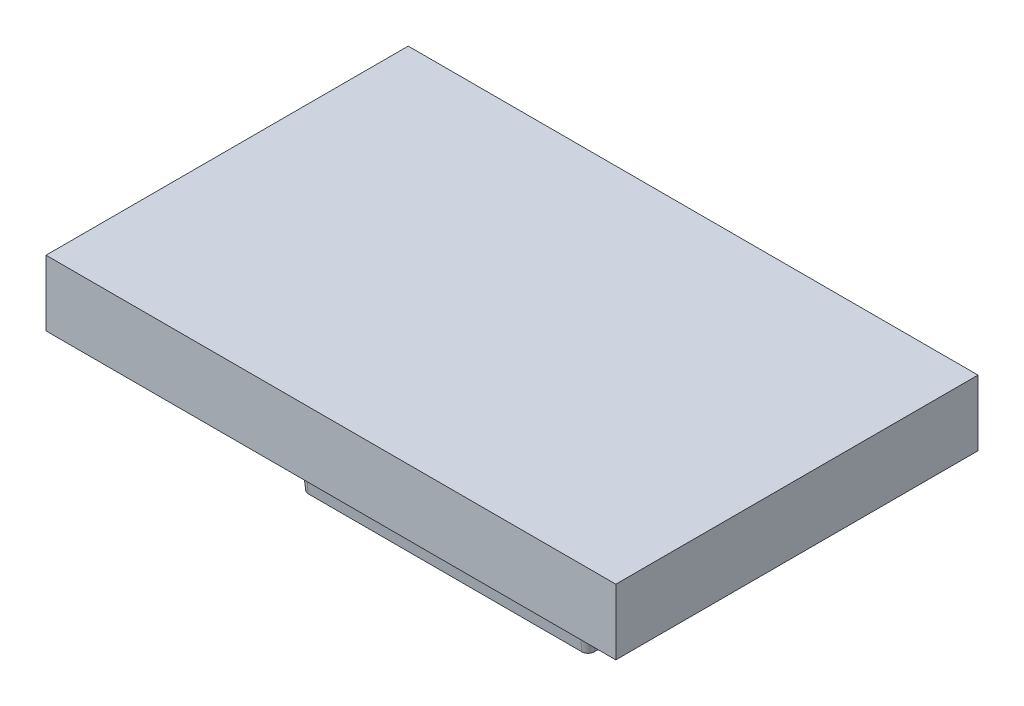
ISO-10303-21;
HEADER;
FILE_DESCRIPTION(('STEP AP214'),'2;1');
FILE_NAME('part.step','',(''),(''),'','','');
FILE_SCHEMA(('AUTOMOTIVE_DESIGN { 1 0 10303 214 1 1 1 1 }'));
ENDSEC;
DATA;
#1=APPLICATION_CONTEXT('core data for automotive mechanical design processes');
#2=APPLICATION_PROTOCOL_DEFINITION('international standard','automotive_design',2000,#1);
#3=PRODUCT_CONTEXT('',#1,'mechanical');
#4=PRODUCT('Part','Part','',(#3));
#5=PRODUCT_RELATED_PRODUCT_CATEGORY('part','',(#4));
#6=PRODUCT_DEFINITION_FORMATION('','',#4);
#7=PRODUCT_DEFINITION_CONTEXT('part definition',#1,'design');
#8=PRODUCT_DEFINITION('design','',#6,#7);
#9=PRODUCT_DEFINITION_SHAPE('','',#8);
#10=(LENGTH_UNIT() NAMED_UNIT(*) SI_UNIT(.MILLI.,.METRE.));
#11=(NAMED_UNIT(*) PLANE_ANGLE_UNIT() SI_UNIT($,.RADIAN.));
#12=(NAMED_UNIT(*) SI_UNIT($,.STERADIAN.) SOLID_ANGLE_UNIT());
#13=UNCERTAINTY_MEASURE_WITH_UNIT(LENGTH_MEASURE(1.E-05),#10,'distance_accuracy_value','');
#14=(GEOMETRIC_REPRESENTATION_CONTEXT(3) GLOBAL_UNCERTAINTY_ASSIGNED_CONTEXT((#13)) GLOBAL_UNIT_ASSIGNED_CONTEXT((#10,
#11,#12)) REPRESENTATION_CONTEXT('',''));
#15=CARTESIAN_POINT('',(0.,0.,0.));
#16=DIRECTION('',(0.,0.,1.));
#17=DIRECTION('',(1.,0.,0.));
#18=AXIS2_PLACEMENT_3D('',#15,#16,#17);
#19=CARTESIAN_POINT('',(0.,100.18,0.));
#20=DIRECTION('',(0.,1.,0.));
#21=DIRECTION('',(0.,0.,1.));
#22=AXIS2_PLACEMENT_3D('',#19,#20,#21);
#23=PLANE('',#22);
#24=DIRECTION('',(0.,0.,1.));
#25=VECTOR('',#24,1.);
#26=CARTESIAN_POINT('',(142.792126276609,100.18,-90.7593904150351));
#27=LINE('',#26,#25);
#28=CARTESIAN_POINT('',(142.792126276609,100.18,-90.7593904150351));
#29=VERTEX_POINT('',#28);
#30=CARTESIAN_POINT('',(142.792126276609,100.18,90.7593904150351));
#31=VERTEX_POINT('',#30);
#32=EDGE_CURVE('E248',#29,#31,#27,.T.);
#33=ORIENTED_EDGE('',*,*,#32,.F.);
#34=DIRECTION('',(1.,0.,0.));
#35=VECTOR('',#34,1.);
#36=CARTESIAN_POINT('',(-142.792126276609,100.18,-90.7593904150351));
#37=LINE('',#36,#35);
#38=CARTESIAN_POINT('',(-142.792126276609,100.18,-90.7593904150351));
#39=VERTEX_POINT('',#38);
#40=EDGE_CURVE('E257',#39,#29,#37,.T.);
#41=ORIENTED_EDGE('',*,*,#40,.F.);
#42=DIRECTION('',(0.,0.,-1.));
#43=VECTOR('',#42,1.);
#44=CARTESIAN_POINT('',(-142.792126276609,100.18,-90.7593904150351));
#45=LINE('',#44,#43);
#46=CARTESIAN_POINT('',(-142.792126276609,100.18,90.7593904150351));
#47=VERTEX_POINT('',#46);
#48=EDGE_CURVE('E254',#47,#39,#45,.T.);
#49=ORIENTED_EDGE('',*,*,#48,.F.);
#50=DIRECTION('',(-1.,0.,0.));
#51=VECTOR('',#50,1.);
#52=CARTESIAN_POINT('',(-142.792126276609,100.18,90.7593904150351));
#53=LINE('',#52,#51);
#54=EDGE_CURVE('E251',#31,#47,#53,.T.);
#55=ORIENTED_EDGE('',*,*,#54,.F.);
#56=EDGE_LOOP('',(#33,#41,#49,#55));
#57=FACE_BOUND('',#56,.T.);
#58=ADVANCED_FACE('F34',(#57),#23,.T.);
#59=CARTESIAN_POINT('',(-142.792126276609,100.18,90.7593904150351));
#60=DIRECTION('',(0.,0.,1.));
#61=DIRECTION('',(1.,0.,0.));
#62=AXIS2_PLACEMENT_3D('',#59,#60,#61);
#63=PLANE('',#62);
#64=DIRECTION('',(0.,-1.,0.));
#65=VECTOR('',#64,1.);
#66=CARTESIAN_POINT('',(-142.792126276609,100.18,90.7593904150351));
#67=LINE('',#66,#65);
#68=CARTESIAN_POINT('',(-142.792126276609,67.31,90.7593904150351));
#69=VERTEX_POINT('',#68);
#70=EDGE_CURVE('E267',#47,#69,#67,.T.);
#71=ORIENTED_EDGE('',*,*,#70,.T.);
#72=DIRECTION('',(1.,0.,0.));
#73=VECTOR('',#72,1.);
#74=CARTESIAN_POINT('',(-142.792126276609,67.31,90.7593904150351));
#75=LINE('',#74,#73);
#76=CARTESIAN_POINT('',(142.792126276609,67.31,90.7593904150351));
#77=VERTEX_POINT('',#76);
#78=EDGE_CURVE('E38',#69,#77,#75,.T.);
#79=ORIENTED_EDGE('',*,*,#78,.T.);
#80=DIRECTION('',(0.,-1.,0.));
#81=VECTOR('',#80,1.);
#82=CARTESIAN_POINT('',(142.792126276609,100.18,90.7593904150351));
#83=LINE('',#82,#81);
#84=EDGE_CURVE('E260',#31,#77,#83,.T.);
#85=ORIENTED_EDGE('',*,*,#84,.F.);
#86=ORIENTED_EDGE('',*,*,#54,.T.);
#87=EDGE_LOOP('',(#71,#79,#85,#86));
#88=FACE_BOUND('',#87,.T.);
#89=ADVANCED_FACE('F284',(#88),#63,.T.);
#90=CARTESIAN_POINT('',(-142.792126276609,100.18,-90.7593904150351));
#91=DIRECTION('',(-1.,0.,0.));
#92=DIRECTION('',(0.,0.,1.));
#93=AXIS2_PLACEMENT_3D('',#90,#91,#92);
#94=PLANE('',#93);
#95=DIRECTION('',(0.,-1.,0.));
#96=VECTOR('',#95,1.);
#97=CARTESIAN_POINT('',(-142.792126276609,100.18,-90.7593904150351));
#98=LINE('',#97,#96);
#99=CARTESIAN_POINT('',(-142.792126276609,67.31,-90.7593904150351));
#100=VERTEX_POINT('',#99);
#101=EDGE_CURVE('E264',#39,#100,#98,.T.);
#102=ORIENTED_EDGE('',*,*,#101,.T.);
#103=DIRECTION('',(0.,0.,1.));
#104=VECTOR('',#103,1.);
#105=CARTESIAN_POINT('',(-142.792126276609,67.31,-90.7593904150351));
#106=LINE('',#105,#104);
#107=EDGE_CURVE('E221',#100,#69,#106,.T.);
#108=ORIENTED_EDGE('',*,*,#107,.T.);
#109=ORIENTED_EDGE('',*,*,#70,.F.);
#110=ORIENTED_EDGE('',*,*,#48,.T.);
#111=EDGE_LOOP('',(#102,#108,#109,#110));
#112=FACE_BOUND('',#111,.T.);
#113=ADVANCED_FACE('F294',(#112),#94,.T.);
#114=CARTESIAN_POINT('',(-142.792126276609,100.18,-90.7593904150351));
#115=DIRECTION('',(0.,0.,-1.));
#116=DIRECTION('',(-1.,0.,0.));
#117=AXIS2_PLACEMENT_3D('',#114,#115,#116);
#118=PLANE('',#117);
#119=DIRECTION('',(0.,-1.,0.));
#120=VECTOR('',#119,1.);
#121=CARTESIAN_POINT('',(142.792126276609,100.18,-90.7593904150351));
#122=LINE('',#121,#120);
#123=CARTESIAN_POINT('',(142.792126276609,67.31,-90.7593904150351));
#124=VERTEX_POINT('',#123);
#125=EDGE_CURVE('E261',#29,#124,#122,.T.);
#126=ORIENTED_EDGE('',*,*,#125,.T.);
#127=DIRECTION('',(-1.,0.,0.));
#128=VECTOR('',#127,1.);
#129=CARTESIAN_POINT('',(-142.792126276609,67.31,-90.7593904150351));
#130=LINE('',#129,#128);
#131=EDGE_CURVE('E242',#124,#100,#130,.T.);
#132=ORIENTED_EDGE('',*,*,#131,.T.);
#133=ORIENTED_EDGE('',*,*,#101,.F.);
#134=ORIENTED_EDGE('',*,*,#40,.T.);
#135=EDGE_LOOP('',(#126,#132,#133,#134));
#136=FACE_BOUND('',#135,.T.);
#137=ADVANCED_FACE('F303',(#136),#118,.T.);
#138=CARTESIAN_POINT('',(142.792126276609,100.18,-90.7593904150351));
#139=DIRECTION('',(1.,0.,0.));
#140=DIRECTION('',(0.,0.,-1.));
#141=AXIS2_PLACEMENT_3D('',#138,#139,#140);
#142=PLANE('',#141);
#143=ORIENTED_EDGE('',*,*,#84,.T.);
#144=DIRECTION('',(0.,0.,-1.));
#145=VECTOR('',#144,1.);
#146=CARTESIAN_POINT('',(142.792126276609,67.31,-90.7593904150351));
#147=LINE('',#146,#145);
#148=EDGE_CURVE('E245',#77,#124,#147,.T.);
#149=ORIENTED_EDGE('',*,*,#148,.T.);
#150=ORIENTED_EDGE('',*,*,#125,.F.);
#151=ORIENTED_EDGE('',*,*,#32,.T.);
#152=EDGE_LOOP('',(#143,#149,#150,#151));
#153=FACE_BOUND('',#152,.T.);
#154=ADVANCED_FACE('F36',(#153),#142,.T.);
#155=CARTESIAN_POINT('',(0.,-3.42971311667862,32.6315405655082));
#156=DIRECTION('',(0.,0.104528463267653,-0.994521895368274));
#157=DIRECTION('',(0.,0.994521895368274,0.104528463267653));
#158=AXIS2_PLACEMENT_3D('',#155,#156,#157);
#159=PLANE('',#158);
#160=DIRECTION('',(0.,-0.994521895368273,-0.104528463267654));
#161=VECTOR('',#160,1.);
#162=CARTESIAN_POINT('',(-68.58,0.531004593399681,33.0478287715292));
#163=LINE('',#162,#161);
#164=CARTESIAN_POINT('',(-68.58,63.5,39.6661368791878));
#165=VERTEX_POINT('',#164);
#166=CARTESIAN_POINT('',(-68.58,5.08,33.525947454967));
#167=VERTEX_POINT('',#166);
#168=EDGE_CURVE('E183',#165,#167,#163,.T.);
#169=ORIENTED_EDGE('',*,*,#168,.T.);
#170=DIRECTION('',(-1.,0.,0.));
#171=VECTOR('',#170,1.);
#172=CARTESIAN_POINT('',(68.58,5.08,33.525947454967));
#173=LINE('',#172,#171);
#174=CARTESIAN_POINT('',(68.58,5.08,33.525947454967));
#175=VERTEX_POINT('',#174);
#176=EDGE_CURVE('E208',#167,#175,#173,.F.);
#177=ORIENTED_EDGE('',*,*,#176,.T.);
#178=DIRECTION('',(0.,0.994521895368273,0.104528463267654));
#179=VECTOR('',#178,1.);
#180=CARTESIAN_POINT('',(68.58,0.531004593399681,33.0478287715292));
#181=LINE('',#180,#179);
#182=CARTESIAN_POINT('',(68.58,63.5,39.6661368791878));
#183=VERTEX_POINT('',#182);
#184=EDGE_CURVE('E182',#183,#175,#181,.F.);
#185=ORIENTED_EDGE('',*,*,#184,.F.);
#186=DIRECTION('',(-1.,0.,0.));
#187=VECTOR('',#186,1.);
#188=CARTESIAN_POINT('',(-68.5799999999999,63.5,39.6661368791878));
#189=LINE('',#188,#187);
#190=EDGE_CURVE('E179',#165,#183,#189,.F.);
#191=ORIENTED_EDGE('',*,*,#190,.F.);
#192=EDGE_LOOP('',(#169,#177,#185,#191));
#193=FACE_BOUND('',#192,.T.);
#194=ADVANCED_FACE('F362',(#193),#159,.F.);
#195=CARTESIAN_POINT('',(68.58,5.08,-30.48));
#196=DIRECTION('',(0.,-1.,0.));
#197=DIRECTION('',(0.,0.,-1.));
#198=AXIS2_PLACEMENT_3D('',#195,#196,#197);
#199=PLANE('',#198);
#200=CARTESIAN_POINT('',(68.58,5.08,-30.48));
#201=DIRECTION('',(0.,-1.,0.));
#202=DIRECTION('',(0.,0.,-1.));
#203=AXIS2_PLACEMENT_3D('',#200,#201,#202);
#204=CIRCLE('',#203,3.04594745496697);
#205=CARTESIAN_POINT('',(71.625947454967,5.08,-30.48));
#206=VERTEX_POINT('',#205);
#207=CARTESIAN_POINT('',(68.58,5.08,-33.525947454967));
#208=VERTEX_POINT('',#207);
#209=EDGE_CURVE('E204',#206,#208,#204,.F.);
#210=ORIENTED_EDGE('',*,*,#209,.F.);
#211=DIRECTION('',(0.,0.,1.));
#212=VECTOR('',#211,1.);
#213=CARTESIAN_POINT('',(71.625947454967,5.08,-30.48));
#214=LINE('',#213,#212);
#215=CARTESIAN_POINT('',(71.625947454967,5.08,30.48));
#216=VERTEX_POINT('',#215);
#217=EDGE_CURVE('E203',#216,#206,#214,.F.);
#218=ORIENTED_EDGE('',*,*,#217,.F.);
#219=CARTESIAN_POINT('',(68.58,5.08,30.48));
#220=DIRECTION('',(0.,-1.,0.));
#221=DIRECTION('',(0.,0.,-1.));
#222=AXIS2_PLACEMENT_3D('',#219,#220,#221);
#223=CIRCLE('',#222,3.04594745496697);
#224=EDGE_CURVE('E213',#175,#216,#223,.F.);
#225=ORIENTED_EDGE('',*,*,#224,.F.);
#226=ORIENTED_EDGE('',*,*,#176,.F.);
#227=CARTESIAN_POINT('',(-68.58,5.08,30.48));
#228=DIRECTION('',(0.,-1.,0.));
#229=DIRECTION('',(0.,0.,-1.));
#230=AXIS2_PLACEMENT_3D('',#227,#228,#229);
#231=CIRCLE('',#230,3.04594745496697);
#232=CARTESIAN_POINT('',(-71.6259474549669,5.08,30.48));
#233=VERTEX_POINT('',#232);
#234=EDGE_CURVE('E218',#233,#167,#231,.F.);
#235=ORIENTED_EDGE('',*,*,#234,.F.);
#236=DIRECTION('',(0.,0.,-1.));
#237=VECTOR('',#236,1.);
#238=CARTESIAN_POINT('',(-71.625947454967,5.08,-30.48));
#239=LINE('',#238,#237);
#240=CARTESIAN_POINT('',(-71.625947454967,5.08,-30.48));
#241=VERTEX_POINT('',#240);
#242=EDGE_CURVE('E228',#241,#233,#239,.F.);
#243=ORIENTED_EDGE('',*,*,#242,.F.);
#244=CARTESIAN_POINT('',(-68.58,5.08,-30.48));
#245=DIRECTION('',(0.,-1.,0.));
#246=DIRECTION('',(0.,0.,-1.));
#247=AXIS2_PLACEMENT_3D('',#244,#245,#246);
#248=CIRCLE('',#247,3.04594745496697);
#249=CARTESIAN_POINT('',(-68.58,5.08,-33.525947454967));
#250=VERTEX_POINT('',#249);
#251=EDGE_CURVE('E233',#250,#241,#248,.F.);
#252=ORIENTED_EDGE('',*,*,#251,.F.);
#253=DIRECTION('',(1.,0.,0.));
#254=VECTOR('',#253,1.);
#255=CARTESIAN_POINT('',(68.58,5.08,-33.525947454967));
#256=LINE('',#255,#254);
#257=EDGE_CURVE('E207',#208,#250,#256,.F.);
#258=ORIENTED_EDGE('',*,*,#257,.F.);
#259=EDGE_LOOP('',(#210,#218,#225,#226,#235,#243,#252,#258));
#260=FACE_BOUND('',#259,.T.);
#261=ADVANCED_FACE('F355',(#260),#199,.T.);
#262=CARTESIAN_POINT('',(-68.5799999999999,0.531004593399681,-33.0478287715292));
#263=DIRECTION('',(0.,-0.104528463267654,-0.994521895368273));
#264=DIRECTION('',(0.,0.994521895368273,-0.104528463267654));
#265=AXIS2_PLACEMENT_3D('',#262,#263,#264);
#266=PLANE('',#265);
#267=DIRECTION('',(0.,0.994521895368273,-0.104528463267654));
#268=VECTOR('',#267,1.);
#269=CARTESIAN_POINT('',(68.58,0.531004593399681,-33.0478287715292));
#270=LINE('',#269,#268);
#271=CARTESIAN_POINT('',(68.58,63.5,-39.6661368791878));
#272=VERTEX_POINT('',#271);
#273=EDGE_CURVE('E198',#272,#208,#270,.F.);
#274=ORIENTED_EDGE('',*,*,#273,.T.);
#275=ORIENTED_EDGE('',*,*,#257,.T.);
#276=DIRECTION('',(0.,0.994521895368273,-0.104528463267654));
#277=VECTOR('',#276,1.);
#278=CARTESIAN_POINT('',(-68.58,0.531004593399681,-33.0478287715292));
#279=LINE('',#278,#277);
#280=CARTESIAN_POINT('',(-68.5799999999999,63.5,-39.6661368791878));
#281=VERTEX_POINT('',#280);
#282=EDGE_CURVE('E194',#281,#250,#279,.F.);
#283=ORIENTED_EDGE('',*,*,#282,.F.);
#284=DIRECTION('',(1.,0.,0.));
#285=VECTOR('',#284,1.);
#286=CARTESIAN_POINT('',(-68.5799999999999,63.5,-39.6661368791878));
#287=LINE('',#286,#285);
#288=EDGE_CURVE('E195',#272,#281,#287,.F.);
#289=ORIENTED_EDGE('',*,*,#288,.F.);
#290=EDGE_LOOP('',(#274,#275,#283,#289));
#291=FACE_BOUND('',#290,.T.);
#292=ADVANCED_FACE('F377',(#291),#266,.T.);
#293=CARTESIAN_POINT('',(-68.58,0.531004593399681,-30.48));
#294=DIRECTION('',(0.,1.,0.));
#295=DIRECTION('',(0.,0.,1.));
#296=AXIS2_PLACEMENT_3D('',#293,#294,#295);
#297=CONICAL_SURFACE('',#296,2.56782877152917,0.10471975511966);
#298=ORIENTED_EDGE('',*,*,#282,.T.);
#299=ORIENTED_EDGE('',*,*,#251,.T.);
#300=DIRECTION('',(0.104528463267654,-0.994521895368273,0.));
#301=VECTOR('',#300,1.);
#302=CARTESIAN_POINT('',(-71.1478287715292,0.531004593399681,-30.48));
#303=LINE('',#302,#301);
#304=CARTESIAN_POINT('',(-77.7661368791878,63.5,-30.48));
#305=VERTEX_POINT('',#304);
#306=EDGE_CURVE('E190',#305,#241,#303,.T.);
#307=ORIENTED_EDGE('',*,*,#306,.F.);
#308=CARTESIAN_POINT('',(-68.58,63.5,-30.48));
#309=DIRECTION('',(0.,1.,0.));
#310=DIRECTION('',(0.,0.,1.));
#311=AXIS2_PLACEMENT_3D('',#308,#309,#310);
#312=CIRCLE('',#311,9.18613687918781);
#313=EDGE_CURVE('E191',#281,#305,#312,.T.);
#314=ORIENTED_EDGE('',*,*,#313,.F.);
#315=EDGE_LOOP('',(#298,#299,#307,#314));
#316=FACE_BOUND('',#315,.T.);
#317=ADVANCED_FACE('F374',(#316),#297,.T.);
#318=CARTESIAN_POINT('',(-71.1478287715292,0.531004593399681,-30.4799999999999));
#319=DIRECTION('',(-0.994521895368273,-0.104528463267654,0.));
#320=DIRECTION('',(0.104528463267654,-0.994521895368273,0.));
#321=AXIS2_PLACEMENT_3D('',#318,#319,#320);
#322=PLANE('',#321);
#323=ORIENTED_EDGE('',*,*,#306,.T.);
#324=ORIENTED_EDGE('',*,*,#242,.T.);
#325=DIRECTION('',(-0.104528463267654,0.994521895368273,0.));
#326=VECTOR('',#325,1.);
#327=CARTESIAN_POINT('',(-71.1478287715291,0.531004593399681,30.48));
#328=LINE('',#327,#326);
#329=CARTESIAN_POINT('',(-77.7661368791878,63.5,30.4799999999999));
#330=VERTEX_POINT('',#329);
#331=EDGE_CURVE('E186',#330,#233,#328,.F.);
#332=ORIENTED_EDGE('',*,*,#331,.F.);
#333=DIRECTION('',(0.,0.,-1.));
#334=VECTOR('',#333,1.);
#335=CARTESIAN_POINT('',(-77.7661368791878,63.5,-30.4799999999999));
#336=LINE('',#335,#334);
#337=EDGE_CURVE('E187',#305,#330,#336,.F.);
#338=ORIENTED_EDGE('',*,*,#337,.F.);
#339=EDGE_LOOP('',(#323,#324,#332,#338));
#340=FACE_BOUND('',#339,.T.);
#341=ADVANCED_FACE('F370',(#340),#322,.T.);
#342=CARTESIAN_POINT('',(-68.58,0.531004593399681,30.48));
#343=DIRECTION('',(0.,1.,0.));
#344=DIRECTION('',(0.,0.,1.));
#345=AXIS2_PLACEMENT_3D('',#342,#343,#344);
#346=CONICAL_SURFACE('',#345,2.56782877152917,0.10471975511966);
#347=ORIENTED_EDGE('',*,*,#331,.T.);
#348=ORIENTED_EDGE('',*,*,#234,.T.);
#349=ORIENTED_EDGE('',*,*,#168,.F.);
#350=CARTESIAN_POINT('',(-68.58,63.5,30.48));
#351=DIRECTION('',(0.,1.,0.));
#352=DIRECTION('',(0.,0.,1.));
#353=AXIS2_PLACEMENT_3D('',#350,#351,#352);
#354=CIRCLE('',#353,9.18613687918781);
#355=EDGE_CURVE('E178',#330,#165,#354,.T.);
#356=ORIENTED_EDGE('',*,*,#355,.F.);
#357=EDGE_LOOP('',(#347,#348,#349,#356));
#358=FACE_BOUND('',#357,.T.);
#359=ADVANCED_FACE('F367',(#358),#346,.T.);
#360=CARTESIAN_POINT('',(68.58,0.531004593399681,30.48));
#361=DIRECTION('',(0.,1.,0.));
#362=DIRECTION('',(0.,0.,1.));
#363=AXIS2_PLACEMENT_3D('',#360,#361,#362);
#364=CONICAL_SURFACE('',#363,2.56782877152917,0.10471975511966);
#365=ORIENTED_EDGE('',*,*,#184,.T.);
#366=ORIENTED_EDGE('',*,*,#224,.T.);
#367=DIRECTION('',(0.104528463267654,0.994521895368273,0.));
#368=VECTOR('',#367,1.);
#369=CARTESIAN_POINT('',(71.1478287715292,0.531004593399681,30.48));
#370=LINE('',#369,#368);
#371=CARTESIAN_POINT('',(77.7661368791878,63.5,30.48));
#372=VERTEX_POINT('',#371);
#373=EDGE_CURVE('E174',#372,#216,#370,.F.);
#374=ORIENTED_EDGE('',*,*,#373,.F.);
#375=CARTESIAN_POINT('',(68.58,63.5,30.48));
#376=DIRECTION('',(0.,1.,0.));
#377=DIRECTION('',(0.,0.,1.));
#378=AXIS2_PLACEMENT_3D('',#375,#376,#377);
#379=CIRCLE('',#378,9.18613687918781);
#380=EDGE_CURVE('E175',#183,#372,#379,.T.);
#381=ORIENTED_EDGE('',*,*,#380,.F.);
#382=EDGE_LOOP('',(#365,#366,#374,#381));
#383=FACE_BOUND('',#382,.T.);
#384=ADVANCED_FACE('F359',(#383),#364,.T.);
#385=CARTESIAN_POINT('',(71.1478287715292,0.531004593399681,-30.4799999999999));
#386=DIRECTION('',(0.994521895368273,-0.104528463267654,0.));
#387=DIRECTION('',(0.104528463267654,0.994521895368273,0.));
#388=AXIS2_PLACEMENT_3D('',#385,#386,#387);
#389=PLANE('',#388);
#390=ORIENTED_EDGE('',*,*,#373,.T.);
#391=ORIENTED_EDGE('',*,*,#217,.T.);
#392=DIRECTION('',(0.104528463267654,0.994521895368273,0.));
#393=VECTOR('',#392,1.);
#394=CARTESIAN_POINT('',(71.1478287715292,0.531004593399681,-30.48));
#395=LINE('',#394,#393);
#396=CARTESIAN_POINT('',(77.7661368791878,63.5,-30.4799999999999));
#397=VERTEX_POINT('',#396);
#398=EDGE_CURVE('E170',#397,#206,#395,.F.);
#399=ORIENTED_EDGE('',*,*,#398,.F.);
#400=DIRECTION('',(0.,0.,1.));
#401=VECTOR('',#400,1.);
#402=CARTESIAN_POINT('',(77.7661368791878,63.5,-30.4799999999999));
#403=LINE('',#402,#401);
#404=EDGE_CURVE('E171',#372,#397,#403,.F.);
#405=ORIENTED_EDGE('',*,*,#404,.F.);
#406=EDGE_LOOP('',(#390,#391,#399,#405));
#407=FACE_BOUND('',#406,.T.);
#408=ADVANCED_FACE('F351',(#407),#389,.T.);
#409=CARTESIAN_POINT('',(68.58,0.531004593399681,-30.48));
#410=DIRECTION('',(0.,1.,0.));
#411=DIRECTION('',(0.,0.,-1.));
#412=AXIS2_PLACEMENT_3D('',#409,#410,#411);
#413=CONICAL_SURFACE('',#412,2.56782877152917,0.10471975511966);
#414=ORIENTED_EDGE('',*,*,#398,.T.);
#415=ORIENTED_EDGE('',*,*,#209,.T.);
#416=ORIENTED_EDGE('',*,*,#273,.F.);
#417=CARTESIAN_POINT('',(68.58,63.5,-30.48));
#418=DIRECTION('',(0.,1.,0.));
#419=DIRECTION('',(0.,0.,1.));
#420=AXIS2_PLACEMENT_3D('',#417,#418,#419);
#421=CIRCLE('',#420,9.18613687918781);
#422=EDGE_CURVE('E166',#397,#272,#421,.T.);
#423=ORIENTED_EDGE('',*,*,#422,.F.);
#424=EDGE_LOOP('',(#414,#415,#416,#423));
#425=FACE_BOUND('',#424,.T.);
#426=ADVANCED_FACE('F344',(#425),#413,.T.);
#427=CARTESIAN_POINT('',(-68.58,63.5,30.48));
#428=DIRECTION('',(0.,1.,0.));
#429=DIRECTION('',(0.,0.,1.));
#430=AXIS2_PLACEMENT_3D('',#427,#428,#429);
#431=PLANE('',#430);
#432=ORIENTED_EDGE('',*,*,#422,.T.);
#433=ORIENTED_EDGE('',*,*,#288,.T.);
#434=ORIENTED_EDGE('',*,*,#313,.T.);
#435=ORIENTED_EDGE('',*,*,#337,.T.);
#436=ORIENTED_EDGE('',*,*,#355,.T.);
#437=ORIENTED_EDGE('',*,*,#190,.T.);
#438=ORIENTED_EDGE('',*,*,#380,.T.);
#439=ORIENTED_EDGE('',*,*,#404,.T.);
#440=EDGE_LOOP('',(#432,#433,#434,#435,#436,#437,#438,#439));
#441=FACE_BOUND('',#440,.T.);
#442=DIRECTION('',(0.,0.,-1.));
#443=VECTOR('',#442,1.);
#444=CARTESIAN_POINT('',(-71.5594436575904,63.5,30.48));
#445=LINE('',#444,#443);
#446=CARTESIAN_POINT('',(-71.5594436575904,63.5,-30.48));
#447=VERTEX_POINT('',#446);
#448=CARTESIAN_POINT('',(-71.5594436575904,63.5,30.48));
#449=VERTEX_POINT('',#448);
#450=EDGE_CURVE('E169',#447,#449,#445,.F.);
#451=ORIENTED_EDGE('',*,*,#450,.F.);
#452=CARTESIAN_POINT('',(-68.58,63.5,-30.48));
#453=DIRECTION('',(0.,1.,0.));
#454=DIRECTION('',(0.,0.,1.));
#455=AXIS2_PLACEMENT_3D('',#452,#453,#454);
#456=CIRCLE('',#455,2.97944365759047);
#457=CARTESIAN_POINT('',(-68.58,63.5,-33.4594436575905));
#458=VERTEX_POINT('',#457);
#459=EDGE_CURVE('E150',#458,#447,#456,.T.);
#460=ORIENTED_EDGE('',*,*,#459,.F.);
#461=DIRECTION('',(1.,0.,0.));
#462=VECTOR('',#461,1.);
#463=CARTESIAN_POINT('',(-68.58,63.5,-33.4594436575905));
#464=LINE('',#463,#462);
#465=CARTESIAN_POINT('',(68.58,63.5,-33.4594436575905));
#466=VERTEX_POINT('',#465);
#467=EDGE_CURVE('E149',#466,#458,#464,.F.);
#468=ORIENTED_EDGE('',*,*,#467,.F.);
#469=CARTESIAN_POINT('',(68.58,63.5,-30.48));
#470=DIRECTION('',(0.,1.,0.));
#471=DIRECTION('',(0.,0.,1.));
#472=AXIS2_PLACEMENT_3D('',#469,#470,#471);
#473=CIRCLE('',#472,2.97944365759047);
#474=CARTESIAN_POINT('',(71.5594436575905,63.5,-30.48));
#475=VERTEX_POINT('',#474);
#476=EDGE_CURVE('E152',#475,#466,#473,.T.);
#477=ORIENTED_EDGE('',*,*,#476,.F.);
#478=DIRECTION('',(0.,0.,1.));
#479=VECTOR('',#478,1.);
#480=CARTESIAN_POINT('',(71.5594436575905,63.5,30.48));
#481=LINE('',#480,#479);
#482=CARTESIAN_POINT('',(71.5594436575905,63.5,30.48));
#483=VERTEX_POINT('',#482);
#484=EDGE_CURVE('E157',#483,#475,#481,.F.);
#485=ORIENTED_EDGE('',*,*,#484,.F.);
#486=CARTESIAN_POINT('',(68.58,63.5,30.48));
#487=DIRECTION('',(0.,1.,0.));
#488=DIRECTION('',(0.,0.,1.));
#489=AXIS2_PLACEMENT_3D('',#486,#487,#488);
#490=CIRCLE('',#489,2.97944365759047);
#491=CARTESIAN_POINT('',(68.58,63.5,33.4594436575905));
#492=VERTEX_POINT('',#491);
#493=EDGE_CURVE('E898',#492,#483,#490,.T.);
#494=ORIENTED_EDGE('',*,*,#493,.F.);
#495=DIRECTION('',(-1.,0.,0.));
#496=VECTOR('',#495,1.);
#497=CARTESIAN_POINT('',(-68.58,63.5,33.4594436575905));
#498=LINE('',#497,#496);
#499=CARTESIAN_POINT('',(-68.58,63.5,33.4594436575905));
#500=VERTEX_POINT('',#499);
#501=EDGE_CURVE('E903',#500,#492,#498,.F.);
#502=ORIENTED_EDGE('',*,*,#501,.F.);
#503=CARTESIAN_POINT('',(-68.58,63.5,30.48));
#504=DIRECTION('',(0.,1.,0.));
#505=DIRECTION('',(0.,0.,1.));
#506=AXIS2_PLACEMENT_3D('',#503,#504,#505);
#507=CIRCLE('',#506,2.97944365759047);
#508=EDGE_CURVE('E908',#449,#500,#507,.T.);
#509=ORIENTED_EDGE('',*,*,#508,.F.);
#510=EDGE_LOOP('',(#451,#460,#468,#477,#485,#494,#502,#509));
#511=FACE_BOUND('',#510,.T.);
#512=ADVANCED_FACE('F160',(#441,#511),#431,.T.);
#513=CARTESIAN_POINT('',(68.58,67.31,-33.525947454967));
#514=DIRECTION('',(0.,0.0174524064372835,0.999847695156391));
#515=DIRECTION('',(0.,-0.999847695156391,0.0174524064372835));
#516=AXIS2_PLACEMENT_3D('',#513,#514,#515);
#517=PLANE('',#516);
#518=DIRECTION('',(0.,-0.999847695156391,0.0174524064372835));
#519=VECTOR('',#518,1.);
#520=CARTESIAN_POINT('',(68.58,67.31,-33.525947454967));
#521=LINE('',#520,#519);
#522=CARTESIAN_POINT('',(68.58,64.8143291123507,-33.4823853575836));
#523=VERTEX_POINT('',#522);
#524=EDGE_CURVE('E146',#466,#523,#521,.F.);
#525=ORIENTED_EDGE('',*,*,#524,.F.);
#526=ORIENTED_EDGE('',*,*,#467,.T.);
#527=DIRECTION('',(0.,-0.999847695156391,0.0174524064372835));
#528=VECTOR('',#527,1.);
#529=CARTESIAN_POINT('',(-68.58,67.31,-33.525947454967));
#530=LINE('',#529,#528);
#531=CARTESIAN_POINT('',(-68.58,64.8143291123507,-33.4823853575836));
#532=VERTEX_POINT('',#531);
#533=EDGE_CURVE('E852',#458,#532,#530,.F.);
#534=ORIENTED_EDGE('',*,*,#533,.T.);
#535=DIRECTION('',(1.,0.,0.));
#536=VECTOR('',#535,1.);
#537=CARTESIAN_POINT('',(68.58,64.8143291123507,-33.4823853575836));
#538=LINE('',#537,#536);
#539=EDGE_CURVE('E108',#523,#532,#538,.F.);
#540=ORIENTED_EDGE('',*,*,#539,.F.);
#541=EDGE_LOOP('',(#525,#526,#534,#540));
#542=FACE_BOUND('',#541,.T.);
#543=ADVANCED_FACE('F147',(#542),#517,.F.);
#544=CARTESIAN_POINT('',(-68.58,67.31,-30.48));
#545=DIRECTION('',(0.,1.,0.));
#546=DIRECTION('',(0.,0.,1.));
#547=AXIS2_PLACEMENT_3D('',#544,#545,#546);
#548=CONICAL_SURFACE('',#547,3.04594745496698,0.0174532925199433);
#549=ORIENTED_EDGE('',*,*,#533,.F.);
#550=ORIENTED_EDGE('',*,*,#459,.T.);
#551=DIRECTION('',(0.0174524064372835,-0.999847695156391,0.));
#552=VECTOR('',#551,1.);
#553=CARTESIAN_POINT('',(-71.625947454967,67.31,-30.48));
#554=LINE('',#553,#552);
#555=CARTESIAN_POINT('',(-71.5823853575836,64.8143291123507,-30.48));
#556=VERTEX_POINT('',#555);
#557=EDGE_CURVE('E118',#447,#556,#554,.F.);
#558=ORIENTED_EDGE('',*,*,#557,.T.);
#559=CARTESIAN_POINT('',(-68.58,64.8143291123507,-30.48));
#560=DIRECTION('',(0.,-1.,0.));
#561=DIRECTION('',(0.,0.,-1.));
#562=AXIS2_PLACEMENT_3D('',#559,#560,#561);
#563=CIRCLE('',#562,3.00238535758359);
#564=EDGE_CURVE('E858',#532,#556,#563,.F.);
#565=ORIENTED_EDGE('',*,*,#564,.F.);
#566=EDGE_LOOP('',(#549,#550,#558,#565));
#567=FACE_BOUND('',#566,.T.);
#568=ADVANCED_FACE('F527',(#567),#548,.T.);
#569=CARTESIAN_POINT('',(-71.625947454967,67.31,-30.48));
#570=DIRECTION('',(0.999847695156391,0.0174524064372835,0.));
#571=DIRECTION('',(-0.0174524064372835,0.999847695156391,0.));
#572=AXIS2_PLACEMENT_3D('',#569,#570,#571);
#573=PLANE('',#572);
#574=ORIENTED_EDGE('',*,*,#557,.F.);
#575=ORIENTED_EDGE('',*,*,#450,.T.);
#576=DIRECTION('',(0.0174524064372835,-0.999847695156391,0.));
#577=VECTOR('',#576,1.);
#578=CARTESIAN_POINT('',(-71.6259474549669,67.31,30.48));
#579=LINE('',#578,#577);
#580=CARTESIAN_POINT('',(-71.5823853575836,64.8143291123507,30.48));
#581=VERTEX_POINT('',#580);
#582=EDGE_CURVE('E866',#449,#581,#579,.F.);
#583=ORIENTED_EDGE('',*,*,#582,.T.);
#584=DIRECTION('',(0.,0.,-1.));
#585=VECTOR('',#584,1.);
#586=CARTESIAN_POINT('',(-71.5823853575836,64.8143291123507,-30.48));
#587=LINE('',#586,#585);
#588=EDGE_CURVE('E863',#556,#581,#587,.F.);
#589=ORIENTED_EDGE('',*,*,#588,.F.);
#590=EDGE_LOOP('',(#574,#575,#583,#589));
#591=FACE_BOUND('',#590,.T.);
#592=ADVANCED_FACE('F537',(#591),#573,.F.);
#593=CARTESIAN_POINT('',(-68.58,67.31,30.48));
#594=DIRECTION('',(0.,1.,0.));
#595=DIRECTION('',(0.,0.,1.));
#596=AXIS2_PLACEMENT_3D('',#593,#594,#595);
#597=CONICAL_SURFACE('',#596,3.04594745496698,0.0174532925199433);
#598=ORIENTED_EDGE('',*,*,#582,.F.);
#599=ORIENTED_EDGE('',*,*,#508,.T.);
#600=DIRECTION('',(0.,-0.999847695156391,-0.0174524064372835));
#601=VECTOR('',#600,1.);
#602=CARTESIAN_POINT('',(-68.58,67.31,33.525947454967));
#603=LINE('',#602,#601);
#604=CARTESIAN_POINT('',(-68.58,64.8143291123507,33.4823853575836));
#605=VERTEX_POINT('',#604);
#606=EDGE_CURVE('E874',#500,#605,#603,.F.);
#607=ORIENTED_EDGE('',*,*,#606,.T.);
#608=CARTESIAN_POINT('',(-68.58,64.8143291123507,30.48));
#609=DIRECTION('',(0.,-1.,0.));
#610=DIRECTION('',(0.,0.,-1.));
#611=AXIS2_PLACEMENT_3D('',#608,#609,#610);
#612=CIRCLE('',#611,3.00238535758359);
#613=EDGE_CURVE('E871',#581,#605,#612,.F.);
#614=ORIENTED_EDGE('',*,*,#613,.F.);
#615=EDGE_LOOP('',(#598,#599,#607,#614));
#616=FACE_BOUND('',#615,.T.);
#617=ADVANCED_FACE('F548',(#616),#597,.T.);
#618=CARTESIAN_POINT('',(68.58,67.31,33.525947454967));
#619=DIRECTION('',(0.,0.0174524064372835,-0.999847695156391));
#620=DIRECTION('',(0.,0.999847695156391,0.0174524064372835));
#621=AXIS2_PLACEMENT_3D('',#618,#619,#620);
#622=PLANE('',#621);
#623=ORIENTED_EDGE('',*,*,#606,.F.);
#624=ORIENTED_EDGE('',*,*,#501,.T.);
#625=DIRECTION('',(0.,-0.999847695156391,-0.0174524064372835));
#626=VECTOR('',#625,1.);
#627=CARTESIAN_POINT('',(68.58,67.31,33.525947454967));
#628=LINE('',#627,#626);
#629=CARTESIAN_POINT('',(68.58,64.8143291123507,33.4823853575836));
#630=VERTEX_POINT('',#629);
#631=EDGE_CURVE('E882',#492,#630,#628,.F.);
#632=ORIENTED_EDGE('',*,*,#631,.T.);
#633=DIRECTION('',(-1.,0.,0.));
#634=VECTOR('',#633,1.);
#635=CARTESIAN_POINT('',(-68.58,64.8143291123507,33.4823853575836));
#636=LINE('',#635,#634);
#637=EDGE_CURVE('E879',#605,#630,#636,.F.);
#638=ORIENTED_EDGE('',*,*,#637,.F.);
#639=EDGE_LOOP('',(#623,#624,#632,#638));
#640=FACE_BOUND('',#639,.T.);
#641=ADVANCED_FACE('F558',(#640),#622,.F.);
#642=CARTESIAN_POINT('',(68.58,67.31,30.48));
#643=DIRECTION('',(0.,1.,0.));
#644=DIRECTION('',(0.,0.,1.));
#645=AXIS2_PLACEMENT_3D('',#642,#643,#644);
#646=CONICAL_SURFACE('',#645,3.04594745496698,0.0174532925199433);
#647=ORIENTED_EDGE('',*,*,#631,.F.);
#648=ORIENTED_EDGE('',*,*,#493,.T.);
#649=DIRECTION('',(-0.0174524064372835,-0.999847695156391,0.));
#650=VECTOR('',#649,1.);
#651=CARTESIAN_POINT('',(71.625947454967,67.31,30.48));
#652=LINE('',#651,#650);
#653=CARTESIAN_POINT('',(71.5823853575836,64.8143291123507,30.48));
#654=VERTEX_POINT('',#653);
#655=EDGE_CURVE('E888',#483,#654,#652,.F.);
#656=ORIENTED_EDGE('',*,*,#655,.T.);
#657=CARTESIAN_POINT('',(68.58,64.8143291123507,30.48));
#658=DIRECTION('',(0.,-1.,0.));
#659=DIRECTION('',(0.,0.,-1.));
#660=AXIS2_PLACEMENT_3D('',#657,#658,#659);
#661=CIRCLE('',#660,3.00238535758359);
#662=EDGE_CURVE('E885',#630,#654,#661,.F.);
#663=ORIENTED_EDGE('',*,*,#662,.F.);
#664=EDGE_LOOP('',(#647,#648,#656,#663));
#665=FACE_BOUND('',#664,.T.);
#666=ADVANCED_FACE('F569',(#665),#646,.T.);
#667=CARTESIAN_POINT('',(71.625947454967,67.31,-30.48));
#668=DIRECTION('',(-0.999847695156391,0.0174524064372835,0.));
#669=DIRECTION('',(-0.0174524064372835,-0.999847695156391,0.));
#670=AXIS2_PLACEMENT_3D('',#667,#668,#669);
#671=PLANE('',#670);
#672=ORIENTED_EDGE('',*,*,#655,.F.);
#673=ORIENTED_EDGE('',*,*,#484,.T.);
#674=DIRECTION('',(-0.0174524064372835,-0.999847695156391,0.));
#675=VECTOR('',#674,1.);
#676=CARTESIAN_POINT('',(71.625947454967,67.31,-30.48));
#677=LINE('',#676,#675);
#678=CARTESIAN_POINT('',(71.5823853575836,64.8143291123507,-30.48));
#679=VERTEX_POINT('',#678);
#680=EDGE_CURVE('E142',#475,#679,#677,.F.);
#681=ORIENTED_EDGE('',*,*,#680,.T.);
#682=DIRECTION('',(0.,0.,1.));
#683=VECTOR('',#682,1.);
#684=CARTESIAN_POINT('',(71.5823853575836,64.8143291123507,30.48));
#685=LINE('',#684,#683);
#686=EDGE_CURVE('E891',#654,#679,#685,.F.);
#687=ORIENTED_EDGE('',*,*,#686,.F.);
#688=EDGE_LOOP('',(#672,#673,#681,#687));
#689=FACE_BOUND('',#688,.T.);
#690=ADVANCED_FACE('F580',(#689),#671,.F.);
#691=CARTESIAN_POINT('',(68.58,67.31,-30.48));
#692=DIRECTION('',(0.,1.,0.));
#693=DIRECTION('',(0.,0.,1.));
#694=AXIS2_PLACEMENT_3D('',#691,#692,#693);
#695=CONICAL_SURFACE('',#694,3.04594745496698,0.0174532925199433);
#696=ORIENTED_EDGE('',*,*,#680,.F.);
#697=ORIENTED_EDGE('',*,*,#476,.T.);
#698=ORIENTED_EDGE('',*,*,#524,.T.);
#699=CARTESIAN_POINT('',(68.58,64.8143291123507,-30.48));
#700=DIRECTION('',(0.,-1.,0.));
#701=DIRECTION('',(0.,0.,-1.));
#702=AXIS2_PLACEMENT_3D('',#699,#700,#701);
#703=CIRCLE('',#702,3.00238535758359);
#704=EDGE_CURVE('E890',#679,#523,#703,.F.);
#705=ORIENTED_EDGE('',*,*,#704,.F.);
#706=EDGE_LOOP('',(#696,#697,#698,#705));
#707=FACE_BOUND('',#706,.T.);
#708=ADVANCED_FACE('F153',(#707),#695,.T.);
#709=CARTESIAN_POINT('',(68.58,64.77,-30.48));
#710=DIRECTION('',(0.,-1.,0.));
#711=DIRECTION('',(0.,0.,-1.));
#712=AXIS2_PLACEMENT_3D('',#709,#710,#711);
#713=TOROIDAL_SURFACE('',#712,5.54199850328083,2.54);
#714=CARTESIAN_POINT('',(74.1219985032808,64.77,-30.48));
#715=DIRECTION('',(0.,0.,-1.));
#716=DIRECTION('',(0.,1.,0.));
#717=AXIS2_PLACEMENT_3D('',#714,#715,#716);
#718=CIRCLE('',#717,2.54);
#719=CARTESIAN_POINT('',(74.1219985032808,67.31,-30.48));
#720=VERTEX_POINT('',#719);
#721=EDGE_CURVE('E82',#679,#720,#718,.T.);
#722=ORIENTED_EDGE('',*,*,#721,.F.);
#723=ORIENTED_EDGE('',*,*,#704,.T.);
#724=CARTESIAN_POINT('',(68.5799999999999,64.77,-36.0219985032808));
#725=DIRECTION('',(1.,0.,0.));
#726=DIRECTION('',(0.,0.,-1.));
#727=AXIS2_PLACEMENT_3D('',#724,#725,#726);
#728=CIRCLE('',#727,2.54);
#729=CARTESIAN_POINT('',(68.5799999999999,67.31,-36.0219985032808));
#730=VERTEX_POINT('',#729);
#731=EDGE_CURVE('E853',#730,#523,#728,.T.);
#732=ORIENTED_EDGE('',*,*,#731,.F.);
#733=CARTESIAN_POINT('',(68.58,67.31,-30.48));
#734=DIRECTION('',(0.,-1.,0.));
#735=DIRECTION('',(0.,0.,-1.));
#736=AXIS2_PLACEMENT_3D('',#733,#734,#735);
#737=CIRCLE('',#736,5.54199850328083);
#738=EDGE_CURVE('E76',#730,#720,#737,.T.);
#739=ORIENTED_EDGE('',*,*,#738,.T.);
#740=EDGE_LOOP('',(#722,#723,#732,#739));
#741=FACE_BOUND('',#740,.T.);
#742=ADVANCED_FACE('F601',(#741),#713,.F.);
#743=CARTESIAN_POINT('',(74.1219985032808,64.77,30.48));
#744=DIRECTION('',(0.,0.,1.));
#745=DIRECTION('',(1.,0.,0.));
#746=AXIS2_PLACEMENT_3D('',#743,#744,#745);
#747=CYLINDRICAL_SURFACE('',#746,2.54);
#748=CARTESIAN_POINT('',(74.1219985032808,64.77,30.4799999999999));
#749=DIRECTION('',(0.,0.,-1.));
#750=DIRECTION('',(0.,1.,0.));
#751=AXIS2_PLACEMENT_3D('',#748,#749,#750);
#752=CIRCLE('',#751,2.54);
#753=CARTESIAN_POINT('',(74.1219985032808,67.31,30.48));
#754=VERTEX_POINT('',#753);
#755=EDGE_CURVE('E855',#654,#754,#752,.T.);
#756=ORIENTED_EDGE('',*,*,#755,.F.);
#757=ORIENTED_EDGE('',*,*,#686,.T.);
#758=ORIENTED_EDGE('',*,*,#721,.T.);
#759=DIRECTION('',(0.,0.,1.));
#760=VECTOR('',#759,1.);
#761=CARTESIAN_POINT('',(74.1219985032808,67.31,-30.48));
#762=LINE('',#761,#760);
#763=EDGE_CURVE('E878',#720,#754,#762,.T.);
#764=ORIENTED_EDGE('',*,*,#763,.T.);
#765=EDGE_LOOP('',(#756,#757,#758,#764));
#766=FACE_BOUND('',#765,.T.);
#767=ADVANCED_FACE('F611',(#766),#747,.F.);
#768=CARTESIAN_POINT('',(68.58,64.77,30.48));
#769=DIRECTION('',(0.,-1.,0.));
#770=DIRECTION('',(0.,0.,-1.));
#771=AXIS2_PLACEMENT_3D('',#768,#769,#770);
#772=TOROIDAL_SURFACE('',#771,5.54199850328083,2.54);
#773=CARTESIAN_POINT('',(68.58,64.77,36.0219985032808));
#774=DIRECTION('',(1.,0.,0.));
#775=DIRECTION('',(0.,1.,0.));
#776=AXIS2_PLACEMENT_3D('',#773,#774,#775);
#777=CIRCLE('',#776,2.54);
#778=CARTESIAN_POINT('',(68.58,67.31,36.0219985032808));
#779=VERTEX_POINT('',#778);
#780=EDGE_CURVE('E875',#630,#779,#777,.T.);
#781=ORIENTED_EDGE('',*,*,#780,.F.);
#782=ORIENTED_EDGE('',*,*,#662,.T.);
#783=ORIENTED_EDGE('',*,*,#755,.T.);
#784=CARTESIAN_POINT('',(68.58,67.31,30.48));
#785=DIRECTION('',(0.,-1.,0.));
#786=DIRECTION('',(0.,0.,-1.));
#787=AXIS2_PLACEMENT_3D('',#784,#785,#786);
#788=CIRCLE('',#787,5.54199850328083);
#789=EDGE_CURVE('E870',#754,#779,#788,.T.);
#790=ORIENTED_EDGE('',*,*,#789,.T.);
#791=EDGE_LOOP('',(#781,#782,#783,#790));
#792=FACE_BOUND('',#791,.T.);
#793=ADVANCED_FACE('F621',(#792),#772,.F.);
#794=CARTESIAN_POINT('',(-68.58,64.77,36.0219985032808));
#795=DIRECTION('',(-1.,0.,0.));
#796=DIRECTION('',(0.,0.,1.));
#797=AXIS2_PLACEMENT_3D('',#794,#795,#796);
#798=CYLINDRICAL_SURFACE('',#797,2.54);
#799=CARTESIAN_POINT('',(-68.58,64.77,36.0219985032808));
#800=DIRECTION('',(1.,0.,0.));
#801=DIRECTION('',(0.,0.,-1.));
#802=AXIS2_PLACEMENT_3D('',#799,#800,#801);
#803=CIRCLE('',#802,2.54);
#804=CARTESIAN_POINT('',(-68.58,67.31,36.0219985032808));
#805=VERTEX_POINT('',#804);
#806=EDGE_CURVE('E867',#605,#805,#803,.T.);
#807=ORIENTED_EDGE('',*,*,#806,.F.);
#808=ORIENTED_EDGE('',*,*,#637,.T.);
#809=ORIENTED_EDGE('',*,*,#780,.T.);
#810=DIRECTION('',(-1.,0.,0.));
#811=VECTOR('',#810,1.);
#812=CARTESIAN_POINT('',(68.58,67.31,36.0219985032808));
#813=LINE('',#812,#811);
#814=EDGE_CURVE('E862',#779,#805,#813,.T.);
#815=ORIENTED_EDGE('',*,*,#814,.T.);
#816=EDGE_LOOP('',(#807,#808,#809,#815));
#817=FACE_BOUND('',#816,.T.);
#818=ADVANCED_FACE('F632',(#817),#798,.F.);
#819=CARTESIAN_POINT('',(-68.58,64.77,30.48));
#820=DIRECTION('',(0.,-1.,0.));
#821=DIRECTION('',(0.,0.,-1.));
#822=AXIS2_PLACEMENT_3D('',#819,#820,#821);
#823=TOROIDAL_SURFACE('',#822,5.54199850328083,2.54);
#824=CARTESIAN_POINT('',(-74.1219985032808,64.77,30.48));
#825=DIRECTION('',(0.,0.,-1.));
#826=DIRECTION('',(-1.,0.,0.));
#827=AXIS2_PLACEMENT_3D('',#824,#825,#826);
#828=CIRCLE('',#827,2.54);
#829=CARTESIAN_POINT('',(-74.1219985032808,67.31,30.48));
#830=VERTEX_POINT('',#829);
#831=EDGE_CURVE('E860',#830,#581,#828,.T.);
#832=ORIENTED_EDGE('',*,*,#831,.T.);
#833=ORIENTED_EDGE('',*,*,#613,.T.);
#834=ORIENTED_EDGE('',*,*,#806,.T.);
#835=CARTESIAN_POINT('',(-68.58,67.31,30.48));
#836=DIRECTION('',(0.,-1.,0.));
#837=DIRECTION('',(0.,0.,-1.));
#838=AXIS2_PLACEMENT_3D('',#835,#836,#837);
#839=CIRCLE('',#838,5.54199850328083);
#840=EDGE_CURVE('E857',#805,#830,#839,.T.);
#841=ORIENTED_EDGE('',*,*,#840,.T.);
#842=EDGE_LOOP('',(#832,#833,#834,#841));
#843=FACE_BOUND('',#842,.T.);
#844=ADVANCED_FACE('F643',(#843),#823,.F.);
#845=CARTESIAN_POINT('',(-74.1219985032808,64.77,-30.48));
#846=DIRECTION('',(0.,0.,-1.));
#847=DIRECTION('',(-1.,0.,0.));
#848=AXIS2_PLACEMENT_3D('',#845,#846,#847);
#849=CYLINDRICAL_SURFACE('',#848,2.54);
#850=ORIENTED_EDGE('',*,*,#831,.F.);
#851=DIRECTION('',(0.,0.,-1.));
#852=VECTOR('',#851,1.);
#853=CARTESIAN_POINT('',(-74.1219985032808,67.31,-30.48));
#854=LINE('',#853,#852);
#855=CARTESIAN_POINT('',(-74.1219985032808,67.31,-30.48));
#856=VERTEX_POINT('',#855);
#857=EDGE_CURVE('E845',#830,#856,#854,.T.);
#858=ORIENTED_EDGE('',*,*,#857,.T.);
#859=CARTESIAN_POINT('',(-74.1219985032808,64.77,-30.48));
#860=DIRECTION('',(0.,0.,-1.));
#861=DIRECTION('',(-1.,0.,0.));
#862=AXIS2_PLACEMENT_3D('',#859,#860,#861);
#863=CIRCLE('',#862,2.54);
#864=EDGE_CURVE('E848',#856,#556,#863,.T.);
#865=ORIENTED_EDGE('',*,*,#864,.T.);
#866=ORIENTED_EDGE('',*,*,#588,.T.);
#867=EDGE_LOOP('',(#850,#858,#865,#866));
#868=FACE_BOUND('',#867,.T.);
#869=ADVANCED_FACE('F654',(#868),#849,.F.);
#870=CARTESIAN_POINT('',(-68.58,64.77,-30.48));
#871=DIRECTION('',(0.,-1.,0.));
#872=DIRECTION('',(0.,0.,-1.));
#873=AXIS2_PLACEMENT_3D('',#870,#871,#872);
#874=TOROIDAL_SURFACE('',#873,5.54199850328083,2.54);
#875=ORIENTED_EDGE('',*,*,#864,.F.);
#876=CARTESIAN_POINT('',(-68.58,67.31,-30.48));
#877=DIRECTION('',(0.,-1.,0.));
#878=DIRECTION('',(0.,0.,-1.));
#879=AXIS2_PLACEMENT_3D('',#876,#877,#878);
#880=CIRCLE('',#879,5.54199850328083);
#881=CARTESIAN_POINT('',(-68.58,67.31,-36.0219985032808));
#882=VERTEX_POINT('',#881);
#883=EDGE_CURVE('E44',#856,#882,#880,.T.);
#884=ORIENTED_EDGE('',*,*,#883,.T.);
#885=CARTESIAN_POINT('',(-68.58,64.77,-36.0219985032808));
#886=DIRECTION('',(1.,0.,0.));
#887=DIRECTION('',(0.,0.,-1.));
#888=AXIS2_PLACEMENT_3D('',#885,#886,#887);
#889=CIRCLE('',#888,2.54);
#890=EDGE_CURVE('E842',#882,#532,#889,.T.);
#891=ORIENTED_EDGE('',*,*,#890,.T.);
#892=ORIENTED_EDGE('',*,*,#564,.T.);
#893=EDGE_LOOP('',(#875,#884,#891,#892));
#894=FACE_BOUND('',#893,.T.);
#895=ADVANCED_FACE('F665',(#894),#874,.F.);
#896=CARTESIAN_POINT('',(68.58,64.77,-36.0219985032808));
#897=DIRECTION('',(1.,0.,0.));
#898=DIRECTION('',(0.,0.,-1.));
#899=AXIS2_PLACEMENT_3D('',#896,#897,#898);
#900=CYLINDRICAL_SURFACE('',#899,2.54);
#901=ORIENTED_EDGE('',*,*,#890,.F.);
#902=DIRECTION('',(1.,0.,0.));
#903=VECTOR('',#902,1.);
#904=CARTESIAN_POINT('',(68.58,67.31,-36.0219985032808));
#905=LINE('',#904,#903);
#906=EDGE_CURVE('E11',#882,#730,#905,.T.);
#907=ORIENTED_EDGE('',*,*,#906,.T.);
#908=ORIENTED_EDGE('',*,*,#731,.T.);
#909=ORIENTED_EDGE('',*,*,#539,.T.);
#910=EDGE_LOOP('',(#901,#907,#908,#909));
#911=FACE_BOUND('',#910,.T.);
#912=ADVANCED_FACE('F676',(#911),#900,.F.);
#913=CARTESIAN_POINT('',(68.58,67.31,-30.48));
#914=DIRECTION('',(0.,-1.,0.));
#915=DIRECTION('',(0.,0.,-1.));
#916=AXIS2_PLACEMENT_3D('',#913,#914,#915);
#917=PLANE('',#916);
#918=ORIENTED_EDGE('',*,*,#906,.F.);
#919=ORIENTED_EDGE('',*,*,#883,.F.);
#920=ORIENTED_EDGE('',*,*,#857,.F.);
#921=ORIENTED_EDGE('',*,*,#840,.F.);
#922=ORIENTED_EDGE('',*,*,#814,.F.);
#923=ORIENTED_EDGE('',*,*,#789,.F.);
#924=ORIENTED_EDGE('',*,*,#763,.F.);
#925=ORIENTED_EDGE('',*,*,#738,.F.);
#926=EDGE_LOOP('',(#918,#919,#920,#921,#922,#923,#924,#925));
#927=FACE_BOUND('',#926,.T.);
#928=ORIENTED_EDGE('',*,*,#78,.F.);
#929=ORIENTED_EDGE('',*,*,#107,.F.);
#930=ORIENTED_EDGE('',*,*,#131,.F.);
#931=ORIENTED_EDGE('',*,*,#148,.F.);
#932=EDGE_LOOP('',(#928,#929,#930,#931));
#933=FACE_BOUND('',#932,.T.);
#934=ADVANCED_FACE('F289',(#927,#933),#917,.T.);
#935=CLOSED_SHELL('',(#58,#89,#113,#137,#154,#194,#261,#292,#317,#341,#359,#384,#408,#426,#512,
#543,#568,#592,#617,#641,#666,#690,#708,#742,#767,#793,#818,#844,#869,#895,#912,#934));
#936=MANIFOLD_SOLID_BREP('B2',#935);
#937=ADVANCED_BREP_SHAPE_REPRESENTATION('',(#18,#936),#14);
#938=SHAPE_DEFINITION_REPRESENTATION(#9,#937);
ENDSEC;
END-ISO-10303-21;
